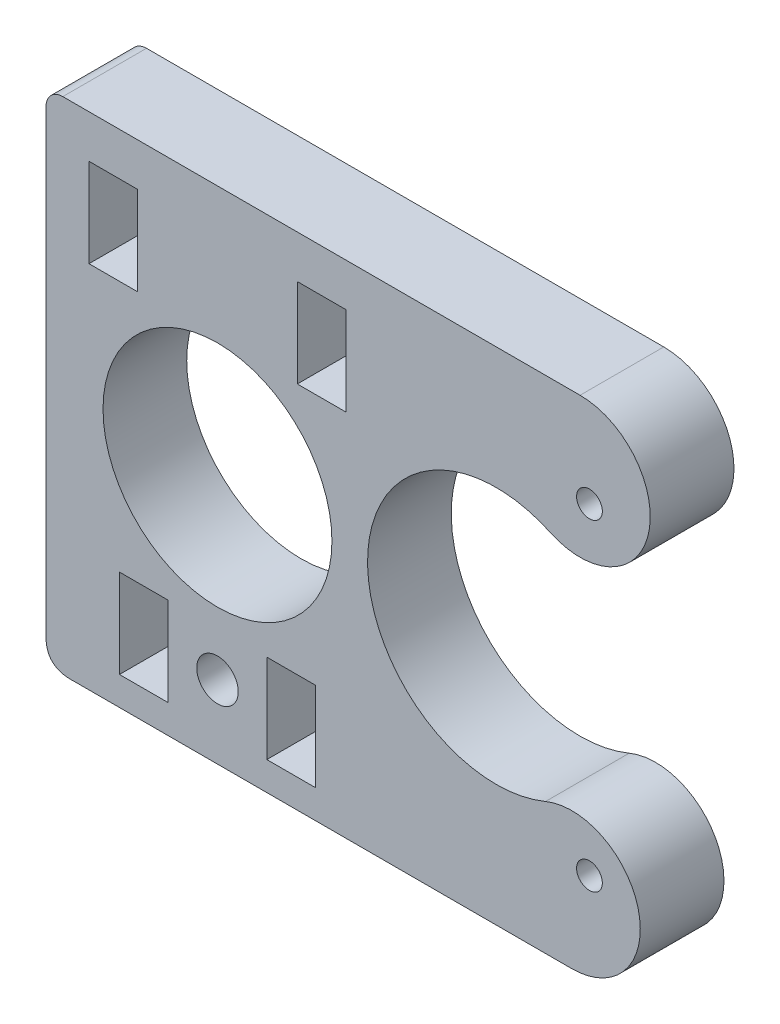
ISO-10303-21;
HEADER;
FILE_DESCRIPTION(('STEP AP214'),'2;1');
FILE_NAME('part.step','',(''),(''),'','','');
FILE_SCHEMA(('AUTOMOTIVE_DESIGN { 1 0 10303 214 1 1 1 1 }'));
ENDSEC;
DATA;
#1=APPLICATION_CONTEXT('core data for automotive mechanical design processes');
#2=APPLICATION_PROTOCOL_DEFINITION('international standard','automotive_design',2000,#1);
#3=PRODUCT_CONTEXT('',#1,'mechanical');
#4=PRODUCT('Part','Part','',(#3));
#5=PRODUCT_RELATED_PRODUCT_CATEGORY('part','',(#4));
#6=PRODUCT_DEFINITION_FORMATION('','',#4);
#7=PRODUCT_DEFINITION_CONTEXT('part definition',#1,'design');
#8=PRODUCT_DEFINITION('design','',#6,#7);
#9=PRODUCT_DEFINITION_SHAPE('','',#8);
#10=(LENGTH_UNIT() NAMED_UNIT(*) SI_UNIT(.MILLI.,.METRE.));
#11=(NAMED_UNIT(*) PLANE_ANGLE_UNIT() SI_UNIT($,.RADIAN.));
#12=(NAMED_UNIT(*) SI_UNIT($,.STERADIAN.) SOLID_ANGLE_UNIT());
#13=UNCERTAINTY_MEASURE_WITH_UNIT(LENGTH_MEASURE(1.E-05),#10,'distance_accuracy_value','');
#14=(GEOMETRIC_REPRESENTATION_CONTEXT(3) GLOBAL_UNCERTAINTY_ASSIGNED_CONTEXT((#13)) GLOBAL_UNIT_ASSIGNED_CONTEXT((#10,
#11,#12)) REPRESENTATION_CONTEXT('',''));
#15=CARTESIAN_POINT('',(0.,0.,0.));
#16=DIRECTION('',(0.,0.,1.));
#17=DIRECTION('',(1.,0.,0.));
#18=AXIS2_PLACEMENT_3D('',#15,#16,#17);
#19=CARTESIAN_POINT('',(683.493527466075,318.93085596433,5.85));
#20=DIRECTION('',(0.,0.,1.));
#21=DIRECTION('',(1.,0.,0.));
#22=AXIS2_PLACEMENT_3D('',#19,#20,#21);
#23=PLANE('',#22);
#24=DIRECTION('',(0.,1.,0.));
#25=VECTOR('',#24,1.);
#26=CARTESIAN_POINT('',(667.706532371359,339.946153339773,5.85));
#27=LINE('',#26,#25);
#28=CARTESIAN_POINT('',(667.706532371359,339.946153339773,5.85));
#29=VERTEX_POINT('',#28);
#30=CARTESIAN_POINT('',(667.706532371359,346.146153339773,5.85));
#31=VERTEX_POINT('',#30);
#32=EDGE_CURVE('E250',#29,#31,#27,.T.);
#33=ORIENTED_EDGE('',*,*,#32,.F.);
#34=DIRECTION('',(1.,0.,0.));
#35=VECTOR('',#34,1.);
#36=CARTESIAN_POINT('',(664.306521371359,339.946153339773,5.85));
#37=LINE('',#36,#35);
#38=CARTESIAN_POINT('',(664.306521371359,339.946153339773,5.85));
#39=VERTEX_POINT('',#38);
#40=EDGE_CURVE('E246',#39,#29,#37,.T.);
#41=ORIENTED_EDGE('',*,*,#40,.F.);
#42=DIRECTION('',(0.,-1.,0.));
#43=VECTOR('',#42,1.);
#44=CARTESIAN_POINT('',(664.306521371359,346.146153339773,5.85));
#45=LINE('',#44,#43);
#46=CARTESIAN_POINT('',(664.306521371359,346.146153339773,5.85));
#47=VERTEX_POINT('',#46);
#48=EDGE_CURVE('E260',#47,#39,#45,.T.);
#49=ORIENTED_EDGE('',*,*,#48,.F.);
#50=DIRECTION('',(-1.,0.,0.));
#51=VECTOR('',#50,1.);
#52=CARTESIAN_POINT('',(667.706532371359,346.146153339773,5.85));
#53=LINE('',#52,#51);
#54=EDGE_CURVE('E265',#31,#47,#53,.T.);
#55=ORIENTED_EDGE('',*,*,#54,.F.);
#56=EDGE_LOOP('',(#33,#41,#49,#55));
#57=FACE_BOUND('',#56,.T.);
#58=DIRECTION('',(0.,1.,0.));
#59=VECTOR('',#58,1.);
#60=CARTESIAN_POINT('',(653.146521371359,339.946153339773,5.85));
#61=LINE('',#60,#59);
#62=CARTESIAN_POINT('',(653.146521371359,339.946153339773,5.85));
#63=VERTEX_POINT('',#62);
#64=CARTESIAN_POINT('',(653.146521371359,346.146153339773,5.85));
#65=VERTEX_POINT('',#64);
#66=EDGE_CURVE('E329',#63,#65,#61,.T.);
#67=ORIENTED_EDGE('',*,*,#66,.F.);
#68=DIRECTION('',(1.,0.,0.));
#69=VECTOR('',#68,1.);
#70=CARTESIAN_POINT('',(649.746510371359,339.946153339773,5.85));
#71=LINE('',#70,#69);
#72=CARTESIAN_POINT('',(649.746510371359,339.946153339773,5.85));
#73=VERTEX_POINT('',#72);
#74=EDGE_CURVE('E325',#73,#63,#71,.T.);
#75=ORIENTED_EDGE('',*,*,#74,.F.);
#76=DIRECTION('',(0.,-1.,0.));
#77=VECTOR('',#76,1.);
#78=CARTESIAN_POINT('',(649.746510371359,346.146153339773,5.85));
#79=LINE('',#78,#77);
#80=CARTESIAN_POINT('',(649.746510371359,346.146153339773,5.85));
#81=VERTEX_POINT('',#80);
#82=EDGE_CURVE('E338',#81,#73,#79,.T.);
#83=ORIENTED_EDGE('',*,*,#82,.F.);
#84=DIRECTION('',(-1.,0.,0.));
#85=VECTOR('',#84,1.);
#86=CARTESIAN_POINT('',(653.146521371359,346.146153339773,5.85));
#87=LINE('',#86,#85);
#88=EDGE_CURVE('E343',#65,#81,#87,.T.);
#89=ORIENTED_EDGE('',*,*,#88,.F.);
#90=EDGE_LOOP('',(#67,#75,#83,#89));
#91=FACE_BOUND('',#90,.T.);
#92=CARTESIAN_POINT('',(658.726521371359,331.646153339773,5.85));
#93=DIRECTION('',(0.,0.,1.));
#94=DIRECTION('',(1.,0.,0.));
#95=AXIS2_PLACEMENT_3D('',#92,#93,#94);
#96=CIRCLE('',#95,7.99999999999999);
#97=CARTESIAN_POINT('',(666.726521371359,331.646153339773,5.85));
#98=VERTEX_POINT('',#97);
#99=EDGE_CURVE('E387',#98,#98,#96,.T.);
#100=ORIENTED_EDGE('',*,*,#99,.F.);
#101=EDGE_LOOP('',(#100));
#102=FACE_BOUND('',#101,.T.);
#103=CARTESIAN_POINT('',(684.726521371359,342.896153339773,5.85));
#104=DIRECTION('',(0.,0.,1.));
#105=DIRECTION('',(1.,0.,0.));
#106=AXIS2_PLACEMENT_3D('',#103,#104,#105);
#107=CIRCLE('',#106,0.899918090527918);
#108=CARTESIAN_POINT('',(685.626439461887,342.896153339773,5.85));
#109=VERTEX_POINT('',#108);
#110=EDGE_CURVE('E388',#109,#109,#107,.T.);
#111=ORIENTED_EDGE('',*,*,#110,.F.);
#112=EDGE_LOOP('',(#111));
#113=FACE_BOUND('',#112,.T.);
#114=DIRECTION('',(1.,0.,0.));
#115=VECTOR('',#114,1.);
#116=CARTESIAN_POINT('',(669.216844170208,314.146153339773,5.85));
#117=LINE('',#116,#115);
#118=CARTESIAN_POINT('',(648.773268795649,314.146153339773,5.85));
#119=VERTEX_POINT('',#118);
#120=CARTESIAN_POINT('',(683.493527466075,314.146153339773,5.85));
#121=VERTEX_POINT('',#120);
#122=EDGE_CURVE('E400',#119,#121,#117,.T.);
#123=ORIENTED_EDGE('',*,*,#122,.T.);
#124=CARTESIAN_POINT('',(683.493527466075,318.93085596433,5.85));
#125=DIRECTION('',(0.,0.,1.));
#126=DIRECTION('',(1.,0.,0.));
#127=AXIS2_PLACEMENT_3D('',#124,#125,#126);
#128=CIRCLE('',#127,4.78470262455656);
#129=CARTESIAN_POINT('',(681.655729570619,323.348533872564,5.85));
#130=VERTEX_POINT('',#129);
#131=EDGE_CURVE('E404',#121,#130,#128,.T.);
#132=ORIENTED_EDGE('',*,*,#131,.T.);
#133=CARTESIAN_POINT('',(678.203837442924,331.646153339773,5.85));
#134=DIRECTION('',(0.,0.,-1.));
#135=DIRECTION('',(1.,0.,0.));
#136=AXIS2_PLACEMENT_3D('',#133,#134,#135);
#137=CIRCLE('',#136,8.98699327271678);
#138=CARTESIAN_POINT('',(681.99878284957,339.792590441011,5.85));
#139=VERTEX_POINT('',#138);
#140=EDGE_CURVE('E409',#130,#139,#137,.T.);
#141=ORIENTED_EDGE('',*,*,#140,.T.);
#142=CARTESIAN_POINT('',(684.070537295917,344.239931701,5.85));
#143=DIRECTION('',(0.,0.,1.));
#144=DIRECTION('',(1.,0.,0.));
#145=AXIS2_PLACEMENT_3D('',#142,#143,#144);
#146=CIRCLE('',#145,4.90622163877252);
#147=CARTESIAN_POINT('',(684.070537295917,349.146153339773,5.85));
#148=VERTEX_POINT('',#147);
#149=EDGE_CURVE('E413',#139,#148,#146,.T.);
#150=ORIENTED_EDGE('',*,*,#149,.T.);
#151=DIRECTION('',(-1.,0.,0.));
#152=VECTOR('',#151,1.);
#153=CARTESIAN_POINT('',(669.216844170208,349.146153339773,5.85));
#154=LINE('',#153,#152);
#155=CARTESIAN_POINT('',(647.916445930545,349.146153339773,5.85));
#156=VERTEX_POINT('',#155);
#157=EDGE_CURVE('E420',#148,#156,#154,.T.);
#158=ORIENTED_EDGE('',*,*,#157,.T.);
#159=CARTESIAN_POINT('',(647.916445930545,347.976217780587,5.85));
#160=DIRECTION('',(0.,0.,1.));
#161=DIRECTION('',(-1.,0.,0.));
#162=AXIS2_PLACEMENT_3D('',#159,#160,#161);
#163=CIRCLE('',#162,1.16993555918601);
#164=CARTESIAN_POINT('',(646.746510371359,347.976217780587,5.85));
#165=VERTEX_POINT('',#164);
#166=EDGE_CURVE('E423',#156,#165,#163,.T.);
#167=ORIENTED_EDGE('',*,*,#166,.T.);
#168=DIRECTION('',(0.,-1.,0.));
#169=VECTOR('',#168,1.);
#170=CARTESIAN_POINT('',(646.746510371359,347.976217780587,5.85));
#171=LINE('',#170,#169);
#172=CARTESIAN_POINT('',(646.746510371359,315.835342781244,5.85));
#173=VERTEX_POINT('',#172);
#174=EDGE_CURVE('E427',#165,#173,#171,.T.);
#175=ORIENTED_EDGE('',*,*,#174,.T.);
#176=CARTESIAN_POINT('',(646.746510371359,315.835342781244,5.85));
#177=CARTESIAN_POINT('',(646.746510371359,314.027167520098,5.85));
#178=CARTESIAN_POINT('',(648.773268795649,314.146153339773,5.85));
#179=B_SPLINE_CURVE_WITH_KNOTS('',2,(#176,#177,#178),.UNSPECIFIED.,.F.,.F.,(3,3),(0.,1.),.UNSPECIFIED.);
#180=EDGE_CURVE('E430',#173,#119,#179,.T.);
#181=ORIENTED_EDGE('',*,*,#180,.T.);
#182=EDGE_LOOP('',(#123,#132,#141,#150,#158,#167,#175,#181));
#183=FACE_BOUND('',#182,.T.);
#184=CARTESIAN_POINT('',(658.726521371359,319.246153339773,5.85));
#185=DIRECTION('',(0.,0.,1.));
#186=DIRECTION('',(1.,0.,0.));
#187=AXIS2_PLACEMENT_3D('',#184,#185,#186);
#188=CIRCLE('',#187,1.44999999999994);
#189=CARTESIAN_POINT('',(660.176521371359,319.246153339773,5.85));
#190=VERTEX_POINT('',#189);
#191=EDGE_CURVE('E377',#190,#190,#188,.T.);
#192=ORIENTED_EDGE('',*,*,#191,.F.);
#193=EDGE_LOOP('',(#192));
#194=FACE_BOUND('',#193,.T.);
#195=CARTESIAN_POINT('',(684.726521371359,320.396153339773,5.85));
#196=DIRECTION('',(0.,0.,1.));
#197=DIRECTION('',(1.,0.,0.));
#198=AXIS2_PLACEMENT_3D('',#195,#196,#197);
#199=CIRCLE('',#198,0.899925125202002);
#200=CARTESIAN_POINT('',(685.626446496561,320.396153339773,5.85));
#201=VERTEX_POINT('',#200);
#202=EDGE_CURVE('E365',#201,#201,#199,.T.);
#203=ORIENTED_EDGE('',*,*,#202,.F.);
#204=EDGE_LOOP('',(#203));
#205=FACE_BOUND('',#204,.T.);
#206=DIRECTION('',(1.,0.,0.));
#207=VECTOR('',#206,1.);
#208=CARTESIAN_POINT('',(651.87652137136,316.146153339773,5.85));
#209=LINE('',#208,#207);
#210=CARTESIAN_POINT('',(651.87652137136,316.146153339773,5.85));
#211=VERTEX_POINT('',#210);
#212=CARTESIAN_POINT('',(655.276521371359,316.146153339773,5.85));
#213=VERTEX_POINT('',#212);
#214=EDGE_CURVE('E291',#211,#213,#209,.T.);
#215=ORIENTED_EDGE('',*,*,#214,.F.);
#216=DIRECTION('',(0.,-1.,0.));
#217=VECTOR('',#216,1.);
#218=CARTESIAN_POINT('',(651.87652137136,322.346153339773,5.85));
#219=LINE('',#218,#217);
#220=CARTESIAN_POINT('',(651.87652137136,322.346153339773,5.85));
#221=VERTEX_POINT('',#220);
#222=EDGE_CURVE('E287',#221,#211,#219,.T.);
#223=ORIENTED_EDGE('',*,*,#222,.F.);
#224=DIRECTION('',(-1.,0.,0.));
#225=VECTOR('',#224,1.);
#226=CARTESIAN_POINT('',(655.276521371359,322.346153339773,5.85));
#227=LINE('',#226,#225);
#228=CARTESIAN_POINT('',(655.276521371359,322.346153339773,5.85));
#229=VERTEX_POINT('',#228);
#230=EDGE_CURVE('E298',#229,#221,#227,.T.);
#231=ORIENTED_EDGE('',*,*,#230,.F.);
#232=DIRECTION('',(0.,1.,0.));
#233=VECTOR('',#232,1.);
#234=CARTESIAN_POINT('',(655.276521371359,316.146153339773,5.85));
#235=LINE('',#234,#233);
#236=EDGE_CURVE('E303',#213,#229,#235,.T.);
#237=ORIENTED_EDGE('',*,*,#236,.F.);
#238=EDGE_LOOP('',(#215,#223,#231,#237));
#239=FACE_BOUND('',#238,.T.);
#240=DIRECTION('',(0.,-1.,0.));
#241=VECTOR('',#240,1.);
#242=CARTESIAN_POINT('',(662.176521371359,322.346153339773,5.85));
#243=LINE('',#242,#241);
#244=CARTESIAN_POINT('',(662.176521371359,322.346153339773,5.85));
#245=VERTEX_POINT('',#244);
#246=CARTESIAN_POINT('',(662.176521371359,316.146153339773,5.85));
#247=VERTEX_POINT('',#246);
#248=EDGE_CURVE('E206',#245,#247,#243,.T.);
#249=ORIENTED_EDGE('',*,*,#248,.F.);
#250=DIRECTION('',(-1.,0.,0.));
#251=VECTOR('',#250,1.);
#252=CARTESIAN_POINT('',(665.576521371359,322.346153339773,5.85));
#253=LINE('',#252,#251);
#254=CARTESIAN_POINT('',(665.576521371359,322.346153339773,5.85));
#255=VERTEX_POINT('',#254);
#256=EDGE_CURVE('E197',#255,#245,#253,.T.);
#257=ORIENTED_EDGE('',*,*,#256,.F.);
#258=DIRECTION('',(0.,1.,0.));
#259=VECTOR('',#258,1.);
#260=CARTESIAN_POINT('',(665.576521371359,316.146153339773,5.85));
#261=LINE('',#260,#259);
#262=CARTESIAN_POINT('',(665.576521371359,316.146153339773,5.85));
#263=VERTEX_POINT('',#262);
#264=EDGE_CURVE('E223',#263,#255,#261,.T.);
#265=ORIENTED_EDGE('',*,*,#264,.F.);
#266=DIRECTION('',(1.,0.,0.));
#267=VECTOR('',#266,1.);
#268=CARTESIAN_POINT('',(662.176521371359,316.146153339773,5.85));
#269=LINE('',#268,#267);
#270=EDGE_CURVE('E218',#247,#263,#269,.T.);
#271=ORIENTED_EDGE('',*,*,#270,.F.);
#272=EDGE_LOOP('',(#249,#257,#265,#271));
#273=FACE_BOUND('',#272,.T.);
#274=ADVANCED_FACE('F36',(#57,#91,#102,#113,#183,#194,#205,#239,#273),#23,.T.);
#275=CARTESIAN_POINT('',(683.493527466075,318.93085596433,0.));
#276=DIRECTION('',(0.,0.,1.));
#277=DIRECTION('',(1.,0.,0.));
#278=AXIS2_PLACEMENT_3D('',#275,#276,#277);
#279=PLANE('',#278);
#280=DIRECTION('',(1.,0.,0.));
#281=VECTOR('',#280,1.);
#282=CARTESIAN_POINT('',(664.306521371359,339.946153339773,0.));
#283=LINE('',#282,#281);
#284=CARTESIAN_POINT('',(664.306521371359,339.946153339773,0.));
#285=VERTEX_POINT('',#284);
#286=CARTESIAN_POINT('',(667.706532371359,339.946153339773,0.));
#287=VERTEX_POINT('',#286);
#288=EDGE_CURVE('E214',#285,#287,#283,.T.);
#289=ORIENTED_EDGE('',*,*,#288,.T.);
#290=DIRECTION('',(0.,1.,0.));
#291=VECTOR('',#290,1.);
#292=CARTESIAN_POINT('',(667.706532371359,339.946153339773,0.));
#293=LINE('',#292,#291);
#294=CARTESIAN_POINT('',(667.706532371359,346.146153339773,0.));
#295=VERTEX_POINT('',#294);
#296=EDGE_CURVE('E269',#287,#295,#293,.T.);
#297=ORIENTED_EDGE('',*,*,#296,.T.);
#298=DIRECTION('',(-1.,0.,0.));
#299=VECTOR('',#298,1.);
#300=CARTESIAN_POINT('',(667.706532371359,346.146153339773,0.));
#301=LINE('',#300,#299);
#302=CARTESIAN_POINT('',(664.306521371359,346.146153339773,0.));
#303=VERTEX_POINT('',#302);
#304=EDGE_CURVE('E272',#295,#303,#301,.T.);
#305=ORIENTED_EDGE('',*,*,#304,.T.);
#306=DIRECTION('',(0.,-1.,0.));
#307=VECTOR('',#306,1.);
#308=CARTESIAN_POINT('',(664.306521371359,346.146153339773,0.));
#309=LINE('',#308,#307);
#310=EDGE_CURVE('E251',#303,#285,#309,.T.);
#311=ORIENTED_EDGE('',*,*,#310,.T.);
#312=EDGE_LOOP('',(#289,#297,#305,#311));
#313=FACE_BOUND('',#312,.T.);
#314=DIRECTION('',(1.,0.,0.));
#315=VECTOR('',#314,1.);
#316=CARTESIAN_POINT('',(649.746510371359,339.946153339773,0.));
#317=LINE('',#316,#315);
#318=CARTESIAN_POINT('',(649.746510371359,339.946153339773,0.));
#319=VERTEX_POINT('',#318);
#320=CARTESIAN_POINT('',(653.146521371359,339.946153339773,0.));
#321=VERTEX_POINT('',#320);
#322=EDGE_CURVE('E324',#319,#321,#317,.T.);
#323=ORIENTED_EDGE('',*,*,#322,.T.);
#324=DIRECTION('',(0.,1.,0.));
#325=VECTOR('',#324,1.);
#326=CARTESIAN_POINT('',(653.146521371359,339.946153339773,0.));
#327=LINE('',#326,#325);
#328=CARTESIAN_POINT('',(653.146521371359,346.146153339773,0.));
#329=VERTEX_POINT('',#328);
#330=EDGE_CURVE('E347',#321,#329,#327,.T.);
#331=ORIENTED_EDGE('',*,*,#330,.T.);
#332=DIRECTION('',(-1.,0.,0.));
#333=VECTOR('',#332,1.);
#334=CARTESIAN_POINT('',(653.146521371359,346.146153339773,0.));
#335=LINE('',#334,#333);
#336=CARTESIAN_POINT('',(649.746510371359,346.146153339773,0.));
#337=VERTEX_POINT('',#336);
#338=EDGE_CURVE('E350',#329,#337,#335,.T.);
#339=ORIENTED_EDGE('',*,*,#338,.T.);
#340=DIRECTION('',(0.,-1.,0.));
#341=VECTOR('',#340,1.);
#342=CARTESIAN_POINT('',(649.746510371359,346.146153339773,0.));
#343=LINE('',#342,#341);
#344=EDGE_CURVE('E330',#337,#319,#343,.T.);
#345=ORIENTED_EDGE('',*,*,#344,.T.);
#346=EDGE_LOOP('',(#323,#331,#339,#345));
#347=FACE_BOUND('',#346,.T.);
#348=CARTESIAN_POINT('',(658.726521371359,331.646153339773,0.));
#349=DIRECTION('',(0.,0.,1.));
#350=DIRECTION('',(1.,0.,0.));
#351=AXIS2_PLACEMENT_3D('',#348,#349,#350);
#352=CIRCLE('',#351,7.99999999999999);
#353=CARTESIAN_POINT('',(666.726521371359,331.646153339773,0.));
#354=VERTEX_POINT('',#353);
#355=EDGE_CURVE('E370',#354,#354,#352,.T.);
#356=ORIENTED_EDGE('',*,*,#355,.T.);
#357=EDGE_LOOP('',(#356));
#358=FACE_BOUND('',#357,.T.);
#359=CARTESIAN_POINT('',(684.726521371359,342.896153339773,0.));
#360=DIRECTION('',(0.,0.,1.));
#361=DIRECTION('',(1.,0.,0.));
#362=AXIS2_PLACEMENT_3D('',#359,#360,#361);
#363=CIRCLE('',#362,0.899918090527918);
#364=CARTESIAN_POINT('',(685.626439461887,342.896153339773,0.));
#365=VERTEX_POINT('',#364);
#366=EDGE_CURVE('E383',#365,#365,#363,.T.);
#367=ORIENTED_EDGE('',*,*,#366,.T.);
#368=EDGE_LOOP('',(#367));
#369=FACE_BOUND('',#368,.T.);
#370=CARTESIAN_POINT('',(683.493527466075,318.93085596433,0.));
#371=DIRECTION('',(0.,0.,1.));
#372=DIRECTION('',(1.,0.,0.));
#373=AXIS2_PLACEMENT_3D('',#370,#371,#372);
#374=CIRCLE('',#373,4.78470262455656);
#375=CARTESIAN_POINT('',(683.493527466075,314.146153339773,0.));
#376=VERTEX_POINT('',#375);
#377=CARTESIAN_POINT('',(681.655729570619,323.348533872564,0.));
#378=VERTEX_POINT('',#377);
#379=EDGE_CURVE('E393',#376,#378,#374,.T.);
#380=ORIENTED_EDGE('',*,*,#379,.F.);
#381=DIRECTION('',(1.,0.,0.));
#382=VECTOR('',#381,1.);
#383=CARTESIAN_POINT('',(648.773268795649,314.146153339773,0.));
#384=LINE('',#383,#382);
#385=CARTESIAN_POINT('',(648.773268795649,314.146153339773,0.));
#386=VERTEX_POINT('',#385);
#387=EDGE_CURVE('E405',#386,#376,#384,.T.);
#388=ORIENTED_EDGE('',*,*,#387,.F.);
#389=CARTESIAN_POINT('',(646.746510371359,315.835342781244,0.));
#390=CARTESIAN_POINT('',(646.746510371359,314.027167520098,0.));
#391=CARTESIAN_POINT('',(648.773268795649,314.146153339773,0.));
#392=B_SPLINE_CURVE_WITH_KNOTS('',2,(#389,#390,#391),.UNSPECIFIED.,.F.,.F.,(3,3),(0.,1.),.UNSPECIFIED.);
#393=CARTESIAN_POINT('',(646.746510371359,315.835342781244,0.));
#394=VERTEX_POINT('',#393);
#395=EDGE_CURVE('E753',#394,#386,#392,.T.);
#396=ORIENTED_EDGE('',*,*,#395,.F.);
#397=DIRECTION('',(0.,-1.,0.));
#398=VECTOR('',#397,1.);
#399=CARTESIAN_POINT('',(646.746510371359,347.976217780587,0.));
#400=LINE('',#399,#398);
#401=CARTESIAN_POINT('',(646.746510371359,347.976217780587,0.));
#402=VERTEX_POINT('',#401);
#403=EDGE_CURVE('E798',#402,#394,#400,.T.);
#404=ORIENTED_EDGE('',*,*,#403,.F.);
#405=CARTESIAN_POINT('',(647.916445930545,347.976217780587,0.));
#406=DIRECTION('',(0.,0.,1.));
#407=DIRECTION('',(-1.,0.,0.));
#408=AXIS2_PLACEMENT_3D('',#405,#406,#407);
#409=CIRCLE('',#408,1.16993555918601);
#410=CARTESIAN_POINT('',(647.916445930545,349.146153339773,0.));
#411=VERTEX_POINT('',#410);
#412=EDGE_CURVE('E796',#411,#402,#409,.T.);
#413=ORIENTED_EDGE('',*,*,#412,.F.);
#414=DIRECTION('',(-1.,0.,0.));
#415=VECTOR('',#414,1.);
#416=CARTESIAN_POINT('',(669.216844170208,349.146153339773,0.));
#417=LINE('',#416,#415);
#418=CARTESIAN_POINT('',(684.070537295917,349.146153339773,0.));
#419=VERTEX_POINT('',#418);
#420=EDGE_CURVE('E793',#419,#411,#417,.T.);
#421=ORIENTED_EDGE('',*,*,#420,.F.);
#422=CARTESIAN_POINT('',(684.070537295917,344.239931701,0.));
#423=DIRECTION('',(0.,0.,1.));
#424=DIRECTION('',(1.,0.,0.));
#425=AXIS2_PLACEMENT_3D('',#422,#423,#424);
#426=CIRCLE('',#425,4.90622163877252);
#427=CARTESIAN_POINT('',(681.99878284957,339.792590441011,0.));
#428=VERTEX_POINT('',#427);
#429=EDGE_CURVE('E791',#428,#419,#426,.T.);
#430=ORIENTED_EDGE('',*,*,#429,.F.);
#431=CARTESIAN_POINT('',(678.203837442924,331.646153339773,0.));
#432=DIRECTION('',(0.,0.,-1.));
#433=DIRECTION('',(1.,0.,0.));
#434=AXIS2_PLACEMENT_3D('',#431,#432,#433);
#435=CIRCLE('',#434,8.98699327271678);
#436=EDGE_CURVE('E758',#378,#428,#435,.T.);
#437=ORIENTED_EDGE('',*,*,#436,.F.);
#438=EDGE_LOOP('',(#380,#388,#396,#404,#413,#421,#430,#437));
#439=FACE_BOUND('',#438,.T.);
#440=CARTESIAN_POINT('',(658.726521371359,319.246153339773,0.));
#441=DIRECTION('',(0.,0.,1.));
#442=DIRECTION('',(1.,0.,0.));
#443=AXIS2_PLACEMENT_3D('',#440,#441,#442);
#444=CIRCLE('',#443,1.44999999999994);
#445=CARTESIAN_POINT('',(660.176521371359,319.246153339773,0.));
#446=VERTEX_POINT('',#445);
#447=EDGE_CURVE('E384',#446,#446,#444,.T.);
#448=ORIENTED_EDGE('',*,*,#447,.T.);
#449=EDGE_LOOP('',(#448));
#450=FACE_BOUND('',#449,.T.);
#451=CARTESIAN_POINT('',(684.726521371359,320.396153339773,0.));
#452=DIRECTION('',(0.,0.,1.));
#453=DIRECTION('',(1.,0.,0.));
#454=AXIS2_PLACEMENT_3D('',#451,#452,#453);
#455=CIRCLE('',#454,0.899925125202002);
#456=CARTESIAN_POINT('',(685.626446496561,320.396153339773,0.));
#457=VERTEX_POINT('',#456);
#458=EDGE_CURVE('E364',#457,#457,#455,.T.);
#459=ORIENTED_EDGE('',*,*,#458,.T.);
#460=EDGE_LOOP('',(#459));
#461=FACE_BOUND('',#460,.T.);
#462=DIRECTION('',(0.,-1.,0.));
#463=VECTOR('',#462,1.);
#464=CARTESIAN_POINT('',(651.87652137136,322.346153339773,0.));
#465=LINE('',#464,#463);
#466=CARTESIAN_POINT('',(651.87652137136,322.346153339773,0.));
#467=VERTEX_POINT('',#466);
#468=CARTESIAN_POINT('',(651.87652137136,316.146153339773,0.));
#469=VERTEX_POINT('',#468);
#470=EDGE_CURVE('E286',#467,#469,#465,.T.);
#471=ORIENTED_EDGE('',*,*,#470,.T.);
#472=DIRECTION('',(1.,0.,0.));
#473=VECTOR('',#472,1.);
#474=CARTESIAN_POINT('',(651.87652137136,316.146153339773,0.));
#475=LINE('',#474,#473);
#476=CARTESIAN_POINT('',(655.276521371359,316.146153339773,0.));
#477=VERTEX_POINT('',#476);
#478=EDGE_CURVE('E307',#469,#477,#475,.T.);
#479=ORIENTED_EDGE('',*,*,#478,.T.);
#480=DIRECTION('',(0.,1.,0.));
#481=VECTOR('',#480,1.);
#482=CARTESIAN_POINT('',(655.276521371359,316.146153339773,0.));
#483=LINE('',#482,#481);
#484=CARTESIAN_POINT('',(655.276521371359,322.346153339773,0.));
#485=VERTEX_POINT('',#484);
#486=EDGE_CURVE('E310',#477,#485,#483,.T.);
#487=ORIENTED_EDGE('',*,*,#486,.T.);
#488=DIRECTION('',(-1.,0.,0.));
#489=VECTOR('',#488,1.);
#490=CARTESIAN_POINT('',(655.276521371359,322.346153339773,0.));
#491=LINE('',#490,#489);
#492=EDGE_CURVE('E292',#485,#467,#491,.T.);
#493=ORIENTED_EDGE('',*,*,#492,.T.);
#494=EDGE_LOOP('',(#471,#479,#487,#493));
#495=FACE_BOUND('',#494,.T.);
#496=DIRECTION('',(-1.,0.,0.));
#497=VECTOR('',#496,1.);
#498=CARTESIAN_POINT('',(665.576521371359,322.346153339773,0.));
#499=LINE('',#498,#497);
#500=CARTESIAN_POINT('',(665.576521371359,322.346153339773,0.));
#501=VERTEX_POINT('',#500);
#502=CARTESIAN_POINT('',(662.176521371359,322.346153339773,0.));
#503=VERTEX_POINT('',#502);
#504=EDGE_CURVE('E59',#501,#503,#499,.T.);
#505=ORIENTED_EDGE('',*,*,#504,.T.);
#506=DIRECTION('',(0.,-1.,0.));
#507=VECTOR('',#506,1.);
#508=CARTESIAN_POINT('',(662.176521371359,322.346153339773,0.));
#509=LINE('',#508,#507);
#510=CARTESIAN_POINT('',(662.176521371359,316.146153339773,0.));
#511=VERTEX_POINT('',#510);
#512=EDGE_CURVE('E213',#503,#511,#509,.T.);
#513=ORIENTED_EDGE('',*,*,#512,.T.);
#514=DIRECTION('',(1.,0.,0.));
#515=VECTOR('',#514,1.);
#516=CARTESIAN_POINT('',(662.176521371359,316.146153339773,0.));
#517=LINE('',#516,#515);
#518=CARTESIAN_POINT('',(665.576521371359,316.146153339773,0.));
#519=VERTEX_POINT('',#518);
#520=EDGE_CURVE('E238',#511,#519,#517,.T.);
#521=ORIENTED_EDGE('',*,*,#520,.T.);
#522=DIRECTION('',(0.,1.,0.));
#523=VECTOR('',#522,1.);
#524=CARTESIAN_POINT('',(665.576521371359,316.146153339773,0.));
#525=LINE('',#524,#523);
#526=EDGE_CURVE('E207',#519,#501,#525,.T.);
#527=ORIENTED_EDGE('',*,*,#526,.T.);
#528=EDGE_LOOP('',(#505,#513,#521,#527));
#529=FACE_BOUND('',#528,.T.);
#530=ADVANCED_FACE('F472',(#313,#347,#358,#369,#439,#450,#461,#495,#529),#279,.F.);
#531=CARTESIAN_POINT('',(683.493527466075,318.93085596433,5.85));
#532=DIRECTION('',(0.,0.,-1.));
#533=DIRECTION('',(-1.,0.,0.));
#534=AXIS2_PLACEMENT_3D('',#531,#532,#533);
#535=CYLINDRICAL_SURFACE('',#534,4.78470262455656);
#536=ORIENTED_EDGE('',*,*,#379,.T.);
#537=DIRECTION('',(0.,0.,-1.));
#538=VECTOR('',#537,1.);
#539=CARTESIAN_POINT('',(681.655729570619,323.348533872564,5.85));
#540=LINE('',#539,#538);
#541=EDGE_CURVE('E44',#130,#378,#540,.T.);
#542=ORIENTED_EDGE('',*,*,#541,.F.);
#543=ORIENTED_EDGE('',*,*,#131,.F.);
#544=DIRECTION('',(0.,0.,-1.));
#545=VECTOR('',#544,1.);
#546=CARTESIAN_POINT('',(683.493527466075,314.146153339773,5.85));
#547=LINE('',#546,#545);
#548=EDGE_CURVE('E12',#121,#376,#547,.T.);
#549=ORIENTED_EDGE('',*,*,#548,.T.);
#550=EDGE_LOOP('',(#536,#542,#543,#549));
#551=FACE_BOUND('',#550,.T.);
#552=ADVANCED_FACE('F38',(#551),#535,.T.);
#553=CARTESIAN_POINT('',(678.203837442924,331.646153339773,5.85));
#554=DIRECTION('',(0.,0.,-1.));
#555=DIRECTION('',(-1.,0.,0.));
#556=AXIS2_PLACEMENT_3D('',#553,#554,#555);
#557=CYLINDRICAL_SURFACE('',#556,8.98699327271678);
#558=ORIENTED_EDGE('',*,*,#436,.T.);
#559=DIRECTION('',(0.,0.,-1.));
#560=VECTOR('',#559,1.);
#561=CARTESIAN_POINT('',(681.99878284957,339.792590441011,5.85));
#562=LINE('',#561,#560);
#563=EDGE_CURVE('E782',#139,#428,#562,.T.);
#564=ORIENTED_EDGE('',*,*,#563,.F.);
#565=ORIENTED_EDGE('',*,*,#140,.F.);
#566=ORIENTED_EDGE('',*,*,#541,.T.);
#567=EDGE_LOOP('',(#558,#564,#565,#566));
#568=FACE_BOUND('',#567,.T.);
#569=ADVANCED_FACE('F465',(#568),#557,.F.);
#570=CARTESIAN_POINT('',(684.070537295917,344.239931701,5.85));
#571=DIRECTION('',(0.,0.,-1.));
#572=DIRECTION('',(-1.,0.,0.));
#573=AXIS2_PLACEMENT_3D('',#570,#571,#572);
#574=CYLINDRICAL_SURFACE('',#573,4.90622163877252);
#575=ORIENTED_EDGE('',*,*,#429,.T.);
#576=DIRECTION('',(0.,0.,-1.));
#577=VECTOR('',#576,1.);
#578=CARTESIAN_POINT('',(684.070537295917,349.146153339773,5.85));
#579=LINE('',#578,#577);
#580=EDGE_CURVE('E779',#148,#419,#579,.T.);
#581=ORIENTED_EDGE('',*,*,#580,.F.);
#582=ORIENTED_EDGE('',*,*,#149,.F.);
#583=ORIENTED_EDGE('',*,*,#563,.T.);
#584=EDGE_LOOP('',(#575,#581,#582,#583));
#585=FACE_BOUND('',#584,.T.);
#586=ADVANCED_FACE('F462',(#585),#574,.T.);
#587=CARTESIAN_POINT('',(669.216844170208,349.146153339773,5.85));
#588=DIRECTION('',(0.,-1.,0.));
#589=DIRECTION('',(0.,0.,-1.));
#590=AXIS2_PLACEMENT_3D('',#587,#588,#589);
#591=PLANE('',#590);
#592=ORIENTED_EDGE('',*,*,#420,.T.);
#593=DIRECTION('',(0.,0.,-1.));
#594=VECTOR('',#593,1.);
#595=CARTESIAN_POINT('',(647.916445930545,349.146153339773,5.85));
#596=LINE('',#595,#594);
#597=EDGE_CURVE('E776',#156,#411,#596,.T.);
#598=ORIENTED_EDGE('',*,*,#597,.F.);
#599=ORIENTED_EDGE('',*,*,#157,.F.);
#600=ORIENTED_EDGE('',*,*,#580,.T.);
#601=EDGE_LOOP('',(#592,#598,#599,#600));
#602=FACE_BOUND('',#601,.T.);
#603=ADVANCED_FACE('F458',(#602),#591,.F.);
#604=CARTESIAN_POINT('',(647.916445930545,347.976217780587,5.85));
#605=DIRECTION('',(0.,0.,-1.));
#606=DIRECTION('',(-1.,0.,0.));
#607=AXIS2_PLACEMENT_3D('',#604,#605,#606);
#608=CYLINDRICAL_SURFACE('',#607,1.16993555918601);
#609=ORIENTED_EDGE('',*,*,#412,.T.);
#610=DIRECTION('',(0.,0.,-1.));
#611=VECTOR('',#610,1.);
#612=CARTESIAN_POINT('',(646.746510371359,347.976217780587,5.85));
#613=LINE('',#612,#611);
#614=EDGE_CURVE('E770',#165,#402,#613,.T.);
#615=ORIENTED_EDGE('',*,*,#614,.F.);
#616=ORIENTED_EDGE('',*,*,#166,.F.);
#617=ORIENTED_EDGE('',*,*,#597,.T.);
#618=EDGE_LOOP('',(#609,#615,#616,#617));
#619=FACE_BOUND('',#618,.T.);
#620=ADVANCED_FACE('F454',(#619),#608,.T.);
#621=CARTESIAN_POINT('',(646.746510371359,347.976217780587,5.85));
#622=DIRECTION('',(1.,0.,0.));
#623=DIRECTION('',(0.,0.,-1.));
#624=AXIS2_PLACEMENT_3D('',#621,#622,#623);
#625=PLANE('',#624);
#626=ORIENTED_EDGE('',*,*,#403,.T.);
#627=DIRECTION('',(0.,0.,-1.));
#628=VECTOR('',#627,1.);
#629=CARTESIAN_POINT('',(646.746510371359,315.835342781244,5.85));
#630=LINE('',#629,#628);
#631=EDGE_CURVE('E768',#173,#394,#630,.T.);
#632=ORIENTED_EDGE('',*,*,#631,.F.);
#633=ORIENTED_EDGE('',*,*,#174,.F.);
#634=ORIENTED_EDGE('',*,*,#614,.T.);
#635=EDGE_LOOP('',(#626,#632,#633,#634));
#636=FACE_BOUND('',#635,.T.);
#637=ADVANCED_FACE('F449',(#636),#625,.F.);
#638=DIRECTION('',(0.,0.,-1.));
#639=VECTOR('',#638,1.);
#640=SURFACE_OF_LINEAR_EXTRUSION('',#179,#639);
#641=ORIENTED_EDGE('',*,*,#395,.T.);
#642=DIRECTION('',(0.,0.,-1.));
#643=VECTOR('',#642,1.);
#644=CARTESIAN_POINT('',(648.773268795649,314.146153339773,5.85));
#645=LINE('',#644,#643);
#646=EDGE_CURVE('E437',#119,#386,#645,.T.);
#647=ORIENTED_EDGE('',*,*,#646,.F.);
#648=ORIENTED_EDGE('',*,*,#180,.F.);
#649=ORIENTED_EDGE('',*,*,#631,.T.);
#650=EDGE_LOOP('',(#641,#647,#648,#649));
#651=FACE_BOUND('',#650,.T.);
#652=ADVANCED_FACE('F444',(#651),#640,.F.);
#653=CARTESIAN_POINT('',(648.773268795649,314.146153339773,5.85));
#654=DIRECTION('',(0.,1.,0.));
#655=DIRECTION('',(0.,0.,1.));
#656=AXIS2_PLACEMENT_3D('',#653,#654,#655);
#657=PLANE('',#656);
#658=ORIENTED_EDGE('',*,*,#387,.T.);
#659=ORIENTED_EDGE('',*,*,#548,.F.);
#660=ORIENTED_EDGE('',*,*,#122,.F.);
#661=ORIENTED_EDGE('',*,*,#646,.T.);
#662=EDGE_LOOP('',(#658,#659,#660,#661));
#663=FACE_BOUND('',#662,.T.);
#664=ADVANCED_FACE('F448',(#663),#657,.F.);
#665=CARTESIAN_POINT('',(684.726521371359,342.896153339773,5.85));
#666=DIRECTION('',(0.,0.,-1.));
#667=DIRECTION('',(-1.,0.,0.));
#668=AXIS2_PLACEMENT_3D('',#665,#666,#667);
#669=CYLINDRICAL_SURFACE('',#668,0.899918090527918);
#670=ORIENTED_EDGE('',*,*,#110,.T.);
#671=EDGE_LOOP('',(#670));
#672=FACE_BOUND('',#671,.T.);
#673=ORIENTED_EDGE('',*,*,#366,.F.);
#674=EDGE_LOOP('',(#673));
#675=FACE_BOUND('',#674,.T.);
#676=ADVANCED_FACE('F484',(#672,#675),#669,.F.);
#677=CARTESIAN_POINT('',(658.726521371359,319.246153339773,5.85));
#678=DIRECTION('',(0.,0.,-1.));
#679=DIRECTION('',(-1.,0.,0.));
#680=AXIS2_PLACEMENT_3D('',#677,#678,#679);
#681=CYLINDRICAL_SURFACE('',#680,1.44999999999994);
#682=ORIENTED_EDGE('',*,*,#191,.T.);
#683=EDGE_LOOP('',(#682));
#684=FACE_BOUND('',#683,.T.);
#685=ORIENTED_EDGE('',*,*,#447,.F.);
#686=EDGE_LOOP('',(#685));
#687=FACE_BOUND('',#686,.T.);
#688=ADVANCED_FACE('F487',(#684,#687),#681,.F.);
#689=CARTESIAN_POINT('',(658.726521371359,331.646153339773,5.85));
#690=DIRECTION('',(0.,0.,-1.));
#691=DIRECTION('',(-1.,0.,0.));
#692=AXIS2_PLACEMENT_3D('',#689,#690,#691);
#693=CYLINDRICAL_SURFACE('',#692,7.99999999999999);
#694=ORIENTED_EDGE('',*,*,#99,.T.);
#695=EDGE_LOOP('',(#694));
#696=FACE_BOUND('',#695,.T.);
#697=ORIENTED_EDGE('',*,*,#355,.F.);
#698=EDGE_LOOP('',(#697));
#699=FACE_BOUND('',#698,.T.);
#700=ADVANCED_FACE('F491',(#696,#699),#693,.F.);
#701=CARTESIAN_POINT('',(684.726521371359,320.396153339773,5.85));
#702=DIRECTION('',(0.,0.,-1.));
#703=DIRECTION('',(-1.,0.,0.));
#704=AXIS2_PLACEMENT_3D('',#701,#702,#703);
#705=CYLINDRICAL_SURFACE('',#704,0.899925125202002);
#706=ORIENTED_EDGE('',*,*,#202,.T.);
#707=EDGE_LOOP('',(#706));
#708=FACE_BOUND('',#707,.T.);
#709=ORIENTED_EDGE('',*,*,#458,.F.);
#710=EDGE_LOOP('',(#709));
#711=FACE_BOUND('',#710,.T.);
#712=ADVANCED_FACE('F495',(#708,#711),#705,.F.);
#713=CARTESIAN_POINT('',(649.746510371359,339.946153339773,5.85));
#714=DIRECTION('',(0.,1.,0.));
#715=DIRECTION('',(0.,0.,1.));
#716=AXIS2_PLACEMENT_3D('',#713,#714,#715);
#717=PLANE('',#716);
#718=ORIENTED_EDGE('',*,*,#322,.F.);
#719=DIRECTION('',(0.,0.,-1.));
#720=VECTOR('',#719,1.);
#721=CARTESIAN_POINT('',(649.746510371359,339.946153339773,5.85));
#722=LINE('',#721,#720);
#723=EDGE_CURVE('E342',#73,#319,#722,.T.);
#724=ORIENTED_EDGE('',*,*,#723,.F.);
#725=ORIENTED_EDGE('',*,*,#74,.T.);
#726=DIRECTION('',(0.,0.,-1.));
#727=VECTOR('',#726,1.);
#728=CARTESIAN_POINT('',(653.146521371359,339.946153339773,5.85));
#729=LINE('',#728,#727);
#730=EDGE_CURVE('E361',#63,#321,#729,.T.);
#731=ORIENTED_EDGE('',*,*,#730,.T.);
#732=EDGE_LOOP('',(#718,#724,#725,#731));
#733=FACE_BOUND('',#732,.T.);
#734=ADVANCED_FACE('F499',(#733),#717,.T.);
#735=CARTESIAN_POINT('',(653.146521371359,339.946153339773,5.85));
#736=DIRECTION('',(-1.,0.,0.));
#737=DIRECTION('',(0.,0.,1.));
#738=AXIS2_PLACEMENT_3D('',#735,#736,#737);
#739=PLANE('',#738);
#740=ORIENTED_EDGE('',*,*,#330,.F.);
#741=ORIENTED_EDGE('',*,*,#730,.F.);
#742=ORIENTED_EDGE('',*,*,#66,.T.);
#743=DIRECTION('',(0.,0.,-1.));
#744=VECTOR('',#743,1.);
#745=CARTESIAN_POINT('',(653.146521371359,346.146153339773,5.85));
#746=LINE('',#745,#744);
#747=EDGE_CURVE('E359',#65,#329,#746,.T.);
#748=ORIENTED_EDGE('',*,*,#747,.T.);
#749=EDGE_LOOP('',(#740,#741,#742,#748));
#750=FACE_BOUND('',#749,.T.);
#751=ADVANCED_FACE('F503',(#750),#739,.T.);
#752=CARTESIAN_POINT('',(653.146521371359,346.146153339773,5.85));
#753=DIRECTION('',(0.,-1.,0.));
#754=DIRECTION('',(0.,0.,-1.));
#755=AXIS2_PLACEMENT_3D('',#752,#753,#754);
#756=PLANE('',#755);
#757=ORIENTED_EDGE('',*,*,#338,.F.);
#758=ORIENTED_EDGE('',*,*,#747,.F.);
#759=ORIENTED_EDGE('',*,*,#88,.T.);
#760=DIRECTION('',(0.,0.,-1.));
#761=VECTOR('',#760,1.);
#762=CARTESIAN_POINT('',(649.746510371359,346.146153339773,5.85));
#763=LINE('',#762,#761);
#764=EDGE_CURVE('E357',#81,#337,#763,.T.);
#765=ORIENTED_EDGE('',*,*,#764,.T.);
#766=EDGE_LOOP('',(#757,#758,#759,#765));
#767=FACE_BOUND('',#766,.T.);
#768=ADVANCED_FACE('F507',(#767),#756,.T.);
#769=CARTESIAN_POINT('',(649.746510371359,346.146153339773,5.85));
#770=DIRECTION('',(1.,0.,0.));
#771=DIRECTION('',(0.,0.,-1.));
#772=AXIS2_PLACEMENT_3D('',#769,#770,#771);
#773=PLANE('',#772);
#774=ORIENTED_EDGE('',*,*,#344,.F.);
#775=ORIENTED_EDGE('',*,*,#764,.F.);
#776=ORIENTED_EDGE('',*,*,#82,.T.);
#777=ORIENTED_EDGE('',*,*,#723,.T.);
#778=EDGE_LOOP('',(#774,#775,#776,#777));
#779=FACE_BOUND('',#778,.T.);
#780=ADVANCED_FACE('F511',(#779),#773,.T.);
#781=CARTESIAN_POINT('',(651.87652137136,322.346153339773,5.85));
#782=DIRECTION('',(1.,0.,0.));
#783=DIRECTION('',(0.,0.,-1.));
#784=AXIS2_PLACEMENT_3D('',#781,#782,#783);
#785=PLANE('',#784);
#786=ORIENTED_EDGE('',*,*,#470,.F.);
#787=DIRECTION('',(0.,0.,-1.));
#788=VECTOR('',#787,1.);
#789=CARTESIAN_POINT('',(651.87652137136,322.346153339773,5.85));
#790=LINE('',#789,#788);
#791=EDGE_CURVE('E302',#221,#467,#790,.T.);
#792=ORIENTED_EDGE('',*,*,#791,.F.);
#793=ORIENTED_EDGE('',*,*,#222,.T.);
#794=DIRECTION('',(0.,0.,-1.));
#795=VECTOR('',#794,1.);
#796=CARTESIAN_POINT('',(651.87652137136,316.146153339773,5.85));
#797=LINE('',#796,#795);
#798=EDGE_CURVE('E321',#211,#469,#797,.T.);
#799=ORIENTED_EDGE('',*,*,#798,.T.);
#800=EDGE_LOOP('',(#786,#792,#793,#799));
#801=FACE_BOUND('',#800,.T.);
#802=ADVANCED_FACE('F515',(#801),#785,.T.);
#803=CARTESIAN_POINT('',(651.87652137136,316.146153339773,5.85));
#804=DIRECTION('',(0.,1.,0.));
#805=DIRECTION('',(0.,0.,1.));
#806=AXIS2_PLACEMENT_3D('',#803,#804,#805);
#807=PLANE('',#806);
#808=ORIENTED_EDGE('',*,*,#478,.F.);
#809=ORIENTED_EDGE('',*,*,#798,.F.);
#810=ORIENTED_EDGE('',*,*,#214,.T.);
#811=DIRECTION('',(0.,0.,-1.));
#812=VECTOR('',#811,1.);
#813=CARTESIAN_POINT('',(655.276521371359,316.146153339773,5.85));
#814=LINE('',#813,#812);
#815=EDGE_CURVE('E319',#213,#477,#814,.T.);
#816=ORIENTED_EDGE('',*,*,#815,.T.);
#817=EDGE_LOOP('',(#808,#809,#810,#816));
#818=FACE_BOUND('',#817,.T.);
#819=ADVANCED_FACE('F519',(#818),#807,.T.);
#820=CARTESIAN_POINT('',(655.276521371359,316.146153339773,5.85));
#821=DIRECTION('',(-1.,0.,0.));
#822=DIRECTION('',(0.,0.,1.));
#823=AXIS2_PLACEMENT_3D('',#820,#821,#822);
#824=PLANE('',#823);
#825=ORIENTED_EDGE('',*,*,#486,.F.);
#826=ORIENTED_EDGE('',*,*,#815,.F.);
#827=ORIENTED_EDGE('',*,*,#236,.T.);
#828=DIRECTION('',(0.,0.,-1.));
#829=VECTOR('',#828,1.);
#830=CARTESIAN_POINT('',(655.276521371359,322.346153339773,5.85));
#831=LINE('',#830,#829);
#832=EDGE_CURVE('E317',#229,#485,#831,.T.);
#833=ORIENTED_EDGE('',*,*,#832,.T.);
#834=EDGE_LOOP('',(#825,#826,#827,#833));
#835=FACE_BOUND('',#834,.T.);
#836=ADVANCED_FACE('F523',(#835),#824,.T.);
#837=CARTESIAN_POINT('',(655.276521371359,322.346153339773,5.85));
#838=DIRECTION('',(0.,-1.,0.));
#839=DIRECTION('',(0.,0.,-1.));
#840=AXIS2_PLACEMENT_3D('',#837,#838,#839);
#841=PLANE('',#840);
#842=ORIENTED_EDGE('',*,*,#492,.F.);
#843=ORIENTED_EDGE('',*,*,#832,.F.);
#844=ORIENTED_EDGE('',*,*,#230,.T.);
#845=ORIENTED_EDGE('',*,*,#791,.T.);
#846=EDGE_LOOP('',(#842,#843,#844,#845));
#847=FACE_BOUND('',#846,.T.);
#848=ADVANCED_FACE('F527',(#847),#841,.T.);
#849=CARTESIAN_POINT('',(664.306521371359,339.946153339773,5.85));
#850=DIRECTION('',(0.,1.,0.));
#851=DIRECTION('',(0.,0.,1.));
#852=AXIS2_PLACEMENT_3D('',#849,#850,#851);
#853=PLANE('',#852);
#854=ORIENTED_EDGE('',*,*,#288,.F.);
#855=DIRECTION('',(0.,0.,-1.));
#856=VECTOR('',#855,1.);
#857=CARTESIAN_POINT('',(664.306521371359,339.946153339773,5.85));
#858=LINE('',#857,#856);
#859=EDGE_CURVE('E264',#39,#285,#858,.T.);
#860=ORIENTED_EDGE('',*,*,#859,.F.);
#861=ORIENTED_EDGE('',*,*,#40,.T.);
#862=DIRECTION('',(0.,0.,-1.));
#863=VECTOR('',#862,1.);
#864=CARTESIAN_POINT('',(667.706532371359,339.946153339773,5.85));
#865=LINE('',#864,#863);
#866=EDGE_CURVE('E283',#29,#287,#865,.T.);
#867=ORIENTED_EDGE('',*,*,#866,.T.);
#868=EDGE_LOOP('',(#854,#860,#861,#867));
#869=FACE_BOUND('',#868,.T.);
#870=ADVANCED_FACE('F531',(#869),#853,.T.);
#871=CARTESIAN_POINT('',(667.706532371359,339.946153339773,5.85));
#872=DIRECTION('',(-1.,0.,0.));
#873=DIRECTION('',(0.,0.,1.));
#874=AXIS2_PLACEMENT_3D('',#871,#872,#873);
#875=PLANE('',#874);
#876=ORIENTED_EDGE('',*,*,#296,.F.);
#877=ORIENTED_EDGE('',*,*,#866,.F.);
#878=ORIENTED_EDGE('',*,*,#32,.T.);
#879=DIRECTION('',(0.,0.,-1.));
#880=VECTOR('',#879,1.);
#881=CARTESIAN_POINT('',(667.706532371359,346.146153339773,5.85));
#882=LINE('',#881,#880);
#883=EDGE_CURVE('E281',#31,#295,#882,.T.);
#884=ORIENTED_EDGE('',*,*,#883,.T.);
#885=EDGE_LOOP('',(#876,#877,#878,#884));
#886=FACE_BOUND('',#885,.T.);
#887=ADVANCED_FACE('F535',(#886),#875,.T.);
#888=CARTESIAN_POINT('',(667.706532371359,346.146153339773,5.85));
#889=DIRECTION('',(0.,-1.,0.));
#890=DIRECTION('',(0.,0.,-1.));
#891=AXIS2_PLACEMENT_3D('',#888,#889,#890);
#892=PLANE('',#891);
#893=ORIENTED_EDGE('',*,*,#304,.F.);
#894=ORIENTED_EDGE('',*,*,#883,.F.);
#895=ORIENTED_EDGE('',*,*,#54,.T.);
#896=DIRECTION('',(0.,0.,-1.));
#897=VECTOR('',#896,1.);
#898=CARTESIAN_POINT('',(664.306521371359,346.146153339773,5.85));
#899=LINE('',#898,#897);
#900=EDGE_CURVE('E279',#47,#303,#899,.T.);
#901=ORIENTED_EDGE('',*,*,#900,.T.);
#902=EDGE_LOOP('',(#893,#894,#895,#901));
#903=FACE_BOUND('',#902,.T.);
#904=ADVANCED_FACE('F539',(#903),#892,.T.);
#905=CARTESIAN_POINT('',(664.306521371359,346.146153339773,5.85));
#906=DIRECTION('',(1.,0.,0.));
#907=DIRECTION('',(0.,0.,-1.));
#908=AXIS2_PLACEMENT_3D('',#905,#906,#907);
#909=PLANE('',#908);
#910=ORIENTED_EDGE('',*,*,#310,.F.);
#911=ORIENTED_EDGE('',*,*,#900,.F.);
#912=ORIENTED_EDGE('',*,*,#48,.T.);
#913=ORIENTED_EDGE('',*,*,#859,.T.);
#914=EDGE_LOOP('',(#910,#911,#912,#913));
#915=FACE_BOUND('',#914,.T.);
#916=ADVANCED_FACE('F543',(#915),#909,.T.);
#917=CARTESIAN_POINT('',(665.576521371359,322.346153339773,5.85));
#918=DIRECTION('',(0.,-1.,0.));
#919=DIRECTION('',(0.,0.,-1.));
#920=AXIS2_PLACEMENT_3D('',#917,#918,#919);
#921=PLANE('',#920);
#922=ORIENTED_EDGE('',*,*,#504,.F.);
#923=DIRECTION('',(0.,0.,-1.));
#924=VECTOR('',#923,1.);
#925=CARTESIAN_POINT('',(665.576521371359,322.346153339773,5.85));
#926=LINE('',#925,#924);
#927=EDGE_CURVE('E201',#255,#501,#926,.T.);
#928=ORIENTED_EDGE('',*,*,#927,.F.);
#929=ORIENTED_EDGE('',*,*,#256,.T.);
#930=DIRECTION('',(0.,0.,-1.));
#931=VECTOR('',#930,1.);
#932=CARTESIAN_POINT('',(662.176521371359,322.346153339773,5.85));
#933=LINE('',#932,#931);
#934=EDGE_CURVE('E200',#245,#503,#933,.T.);
#935=ORIENTED_EDGE('',*,*,#934,.T.);
#936=EDGE_LOOP('',(#922,#928,#929,#935));
#937=FACE_BOUND('',#936,.T.);
#938=ADVANCED_FACE('F199',(#937),#921,.T.);
#939=CARTESIAN_POINT('',(662.176521371359,322.346153339773,5.85));
#940=DIRECTION('',(1.,0.,0.));
#941=DIRECTION('',(0.,0.,-1.));
#942=AXIS2_PLACEMENT_3D('',#939,#940,#941);
#943=PLANE('',#942);
#944=ORIENTED_EDGE('',*,*,#512,.F.);
#945=ORIENTED_EDGE('',*,*,#934,.F.);
#946=ORIENTED_EDGE('',*,*,#248,.T.);
#947=DIRECTION('',(0.,0.,-1.));
#948=VECTOR('',#947,1.);
#949=CARTESIAN_POINT('',(662.176521371359,316.146153339773,5.85));
#950=LINE('',#949,#948);
#951=EDGE_CURVE('E215',#247,#511,#950,.T.);
#952=ORIENTED_EDGE('',*,*,#951,.T.);
#953=EDGE_LOOP('',(#944,#945,#946,#952));
#954=FACE_BOUND('',#953,.T.);
#955=ADVANCED_FACE('F210',(#954),#943,.T.);
#956=CARTESIAN_POINT('',(662.176521371359,316.146153339773,5.85));
#957=DIRECTION('',(0.,1.,0.));
#958=DIRECTION('',(0.,0.,1.));
#959=AXIS2_PLACEMENT_3D('',#956,#957,#958);
#960=PLANE('',#959);
#961=ORIENTED_EDGE('',*,*,#520,.F.);
#962=ORIENTED_EDGE('',*,*,#951,.F.);
#963=ORIENTED_EDGE('',*,*,#270,.T.);
#964=DIRECTION('',(0.,0.,-1.));
#965=VECTOR('',#964,1.);
#966=CARTESIAN_POINT('',(665.576521371359,316.146153339773,5.85));
#967=LINE('',#966,#965);
#968=EDGE_CURVE('E51',#263,#519,#967,.T.);
#969=ORIENTED_EDGE('',*,*,#968,.T.);
#970=EDGE_LOOP('',(#961,#962,#963,#969));
#971=FACE_BOUND('',#970,.T.);
#972=ADVANCED_FACE('F552',(#971),#960,.T.);
#973=CARTESIAN_POINT('',(665.576521371359,316.146153339773,5.85));
#974=DIRECTION('',(-1.,0.,0.));
#975=DIRECTION('',(0.,0.,1.));
#976=AXIS2_PLACEMENT_3D('',#973,#974,#975);
#977=PLANE('',#976);
#978=ORIENTED_EDGE('',*,*,#526,.F.);
#979=ORIENTED_EDGE('',*,*,#968,.F.);
#980=ORIENTED_EDGE('',*,*,#264,.T.);
#981=ORIENTED_EDGE('',*,*,#927,.T.);
#982=EDGE_LOOP('',(#978,#979,#980,#981));
#983=FACE_BOUND('',#982,.T.);
#984=ADVANCED_FACE('F555',(#983),#977,.T.);
#985=CLOSED_SHELL('',(#274,#530,#552,#569,#586,#603,#620,#637,#652,#664,#676,#688,#700,#712,
#734,#751,#768,#780,#802,#819,#836,#848,#870,#887,#904,#916,#938,#955,#972,#984));
#986=MANIFOLD_SOLID_BREP('B2',#985);
#987=ADVANCED_BREP_SHAPE_REPRESENTATION('',(#18,#986),#14);
#988=SHAPE_DEFINITION_REPRESENTATION(#9,#987);
ENDSEC;
END-ISO-10303-21;
